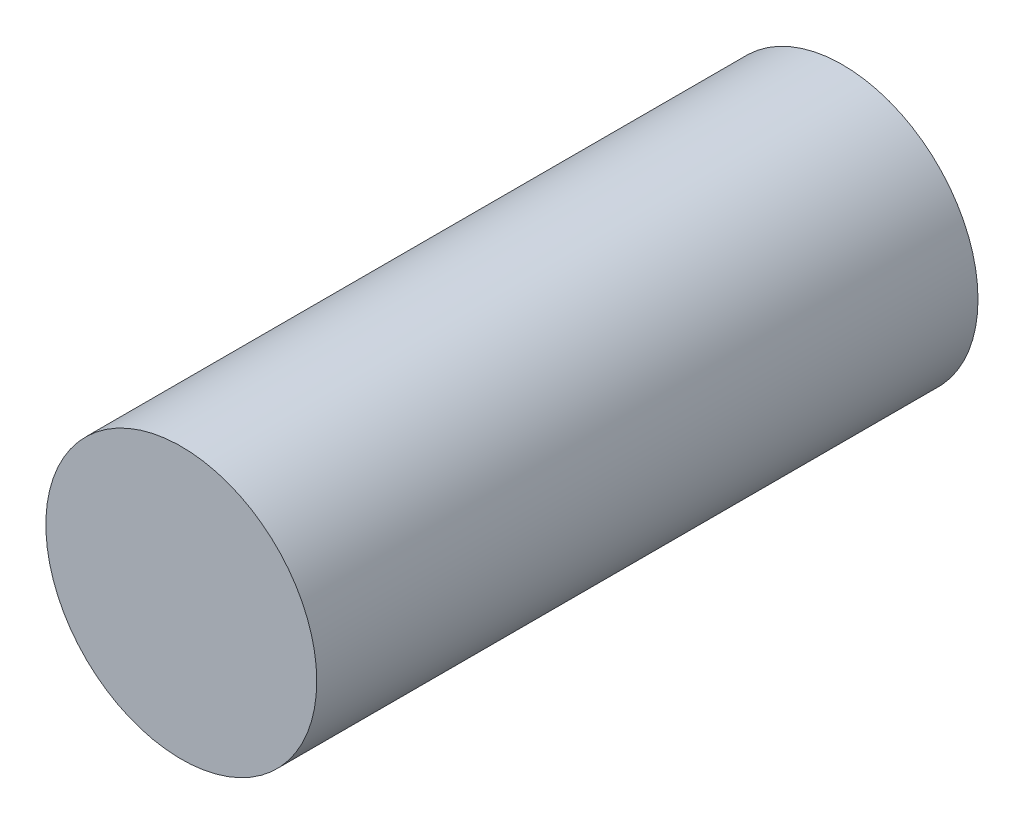
ISO-10303-21;
HEADER;
FILE_DESCRIPTION(('STEP AP214'),'2;1');
FILE_NAME('part.step','',(''),(''),'','','');
FILE_SCHEMA(('AUTOMOTIVE_DESIGN { 1 0 10303 214 1 1 1 1 }'));
ENDSEC;
DATA;
#1=APPLICATION_CONTEXT('core data for automotive mechanical design processes');
#2=APPLICATION_PROTOCOL_DEFINITION('international standard','automotive_design',2000,#1);
#3=PRODUCT_CONTEXT('',#1,'mechanical');
#4=PRODUCT('Part','Part','',(#3));
#5=PRODUCT_RELATED_PRODUCT_CATEGORY('part','',(#4));
#6=PRODUCT_DEFINITION_FORMATION('','',#4);
#7=PRODUCT_DEFINITION_CONTEXT('part definition',#1,'design');
#8=PRODUCT_DEFINITION('design','',#6,#7);
#9=PRODUCT_DEFINITION_SHAPE('','',#8);
#10=(LENGTH_UNIT() NAMED_UNIT(*) SI_UNIT(.MILLI.,.METRE.));
#11=(NAMED_UNIT(*) PLANE_ANGLE_UNIT() SI_UNIT($,.RADIAN.));
#12=(NAMED_UNIT(*) SI_UNIT($,.STERADIAN.) SOLID_ANGLE_UNIT());
#13=UNCERTAINTY_MEASURE_WITH_UNIT(LENGTH_MEASURE(1.E-05),#10,'distance_accuracy_value','');
#14=(GEOMETRIC_REPRESENTATION_CONTEXT(3) GLOBAL_UNCERTAINTY_ASSIGNED_CONTEXT((#13)) GLOBAL_UNIT_ASSIGNED_CONTEXT((#10,
#11,#12)) REPRESENTATION_CONTEXT('',''));
#15=CARTESIAN_POINT('',(0.,0.,0.));
#16=DIRECTION('',(0.,0.,1.));
#17=DIRECTION('',(1.,0.,0.));
#18=AXIS2_PLACEMENT_3D('',#15,#16,#17);
#19=CARTESIAN_POINT('',(0.,0.,5906.114982768));
#20=DIRECTION('',(0.,0.,-1.));
#21=DIRECTION('',(-1.,0.,0.));
#22=AXIS2_PLACEMENT_3D('',#19,#20,#21);
#23=CYLINDRICAL_SURFACE('',#22,1209.8064355512);
#24=CARTESIAN_POINT('',(0.,0.,5906.114982768));
#25=DIRECTION('',(0.,0.,1.));
#26=DIRECTION('',(1.,0.,0.));
#27=AXIS2_PLACEMENT_3D('',#24,#25,#26);
#28=CIRCLE('',#27,1209.8064355512);
#29=CARTESIAN_POINT('',(1209.8064355512,0.,5906.114982768));
#30=VERTEX_POINT('',#29);
#31=EDGE_CURVE('E10',#30,#30,#28,.T.);
#32=ORIENTED_EDGE('',*,*,#31,.F.);
#33=EDGE_LOOP('',(#32));
#34=FACE_BOUND('',#33,.T.);
#35=CARTESIAN_POINT('',(0.,0.,0.));
#36=DIRECTION('',(0.,0.,1.));
#37=DIRECTION('',(1.,0.,0.));
#38=AXIS2_PLACEMENT_3D('',#35,#36,#37);
#39=CIRCLE('',#38,1209.8064355512);
#40=CARTESIAN_POINT('',(1209.8064355512,0.,0.));
#41=VERTEX_POINT('',#40);
#42=EDGE_CURVE('E38',#41,#41,#39,.T.);
#43=ORIENTED_EDGE('',*,*,#42,.T.);
#44=EDGE_LOOP('',(#43));
#45=FACE_BOUND('',#44,.T.);
#46=ADVANCED_FACE('F35',(#34,#45),#23,.T.);
#47=CARTESIAN_POINT('',(0.,0.,5906.114982768));
#48=DIRECTION('',(0.,0.,1.));
#49=DIRECTION('',(1.,0.,0.));
#50=AXIS2_PLACEMENT_3D('',#47,#48,#49);
#51=PLANE('',#50);
#52=ORIENTED_EDGE('',*,*,#31,.T.);
#53=EDGE_LOOP('',(#52));
#54=FACE_BOUND('',#53,.T.);
#55=ADVANCED_FACE('F50',(#54),#51,.T.);
#56=CARTESIAN_POINT('',(0.,0.,0.));
#57=DIRECTION('',(0.,0.,1.));
#58=DIRECTION('',(1.,0.,0.));
#59=AXIS2_PLACEMENT_3D('',#56,#57,#58);
#60=PLANE('',#59);
#61=ORIENTED_EDGE('',*,*,#42,.F.);
#62=EDGE_LOOP('',(#61));
#63=FACE_BOUND('',#62,.T.);
#64=ADVANCED_FACE('F48',(#63),#60,.F.);
#65=CLOSED_SHELL('',(#46,#55,#64));
#66=MANIFOLD_SOLID_BREP('B2',#65);
#67=ADVANCED_BREP_SHAPE_REPRESENTATION('',(#18,#66),#14);
#68=SHAPE_DEFINITION_REPRESENTATION(#9,#67);
ENDSEC;
END-ISO-10303-21;
